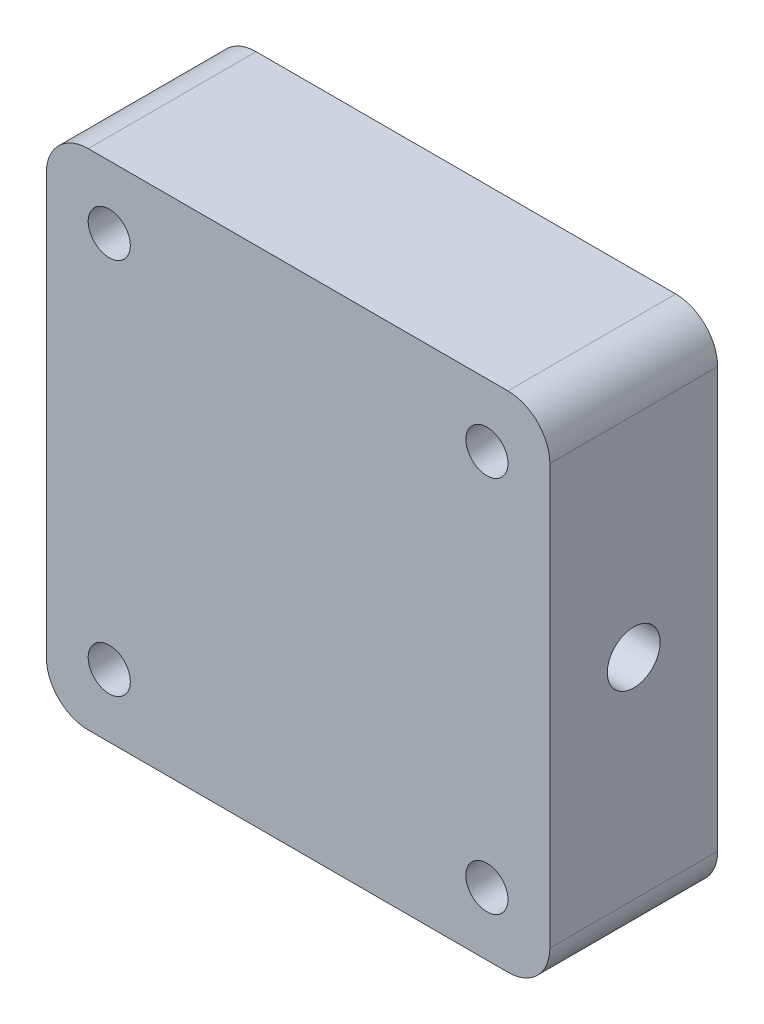
ISO-10303-21;
HEADER;
FILE_DESCRIPTION(('STEP AP214'),'2;1');
FILE_NAME('part.step','',(''),(''),'','','');
FILE_SCHEMA(('AUTOMOTIVE_DESIGN { 1 0 10303 214 1 1 1 1 }'));
ENDSEC;
DATA;
#1=APPLICATION_CONTEXT('core data for automotive mechanical design processes');
#2=APPLICATION_PROTOCOL_DEFINITION('international standard','automotive_design',2000,#1);
#3=PRODUCT_CONTEXT('',#1,'mechanical');
#4=PRODUCT('Part','Part','',(#3));
#5=PRODUCT_RELATED_PRODUCT_CATEGORY('part','',(#4));
#6=PRODUCT_DEFINITION_FORMATION('','',#4);
#7=PRODUCT_DEFINITION_CONTEXT('part definition',#1,'design');
#8=PRODUCT_DEFINITION('design','',#6,#7);
#9=PRODUCT_DEFINITION_SHAPE('','',#8);
#10=(LENGTH_UNIT() NAMED_UNIT(*) SI_UNIT(.MILLI.,.METRE.));
#11=(NAMED_UNIT(*) PLANE_ANGLE_UNIT() SI_UNIT($,.RADIAN.));
#12=(NAMED_UNIT(*) SI_UNIT($,.STERADIAN.) SOLID_ANGLE_UNIT());
#13=UNCERTAINTY_MEASURE_WITH_UNIT(LENGTH_MEASURE(1.E-05),#10,'distance_accuracy_value','');
#14=(GEOMETRIC_REPRESENTATION_CONTEXT(3) GLOBAL_UNCERTAINTY_ASSIGNED_CONTEXT((#13)) GLOBAL_UNIT_ASSIGNED_CONTEXT((#10,
#11,#12)) REPRESENTATION_CONTEXT('',''));
#15=CARTESIAN_POINT('',(0.,0.,0.));
#16=DIRECTION('',(0.,0.,1.));
#17=DIRECTION('',(1.,0.,0.));
#18=AXIS2_PLACEMENT_3D('',#15,#16,#17);
#19=CARTESIAN_POINT('',(-20.955,-20.955,21.082));
#20=DIRECTION('',(0.,0.,1.));
#21=DIRECTION('',(1.,0.,0.));
#22=AXIS2_PLACEMENT_3D('',#19,#20,#21);
#23=PLANE('',#22);
#24=CARTESIAN_POINT('',(18.8595,-18.8595,21.082));
#25=DIRECTION('',(0.,0.,1.));
#26=DIRECTION('',(1.,0.,0.));
#27=AXIS2_PLACEMENT_3D('',#24,#25,#26);
#28=CIRCLE('',#27,2.103882);
#29=CARTESIAN_POINT('',(20.963382,-18.8595,21.082));
#30=VERTEX_POINT('',#29);
#31=EDGE_CURVE('E220',#30,#30,#28,.T.);
#32=ORIENTED_EDGE('',*,*,#31,.F.);
#33=EDGE_LOOP('',(#32));
#34=FACE_BOUND('',#33,.T.);
#35=CARTESIAN_POINT('',(-18.8595,18.8595,21.082));
#36=DIRECTION('',(0.,0.,1.));
#37=DIRECTION('',(1.,0.,0.));
#38=AXIS2_PLACEMENT_3D('',#35,#36,#37);
#39=CIRCLE('',#38,2.103882);
#40=CARTESIAN_POINT('',(-16.755618,18.8595,21.082));
#41=VERTEX_POINT('',#40);
#42=EDGE_CURVE('E145',#41,#41,#39,.T.);
#43=ORIENTED_EDGE('',*,*,#42,.F.);
#44=EDGE_LOOP('',(#43));
#45=FACE_BOUND('',#44,.T.);
#46=CARTESIAN_POINT('',(-20.955,-20.955,21.082));
#47=DIRECTION('',(0.,0.,1.));
#48=DIRECTION('',(1.,0.,0.));
#49=AXIS2_PLACEMENT_3D('',#46,#47,#48);
#50=CIRCLE('',#49,4.191);
#51=CARTESIAN_POINT('',(-25.146,-20.955,21.082));
#52=VERTEX_POINT('',#51);
#53=CARTESIAN_POINT('',(-20.955,-25.146,21.082));
#54=VERTEX_POINT('',#53);
#55=EDGE_CURVE('E163',#52,#54,#50,.T.);
#56=ORIENTED_EDGE('',*,*,#55,.T.);
#57=DIRECTION('',(1.,0.,0.));
#58=VECTOR('',#57,1.);
#59=CARTESIAN_POINT('',(-20.955,-25.146,21.082));
#60=LINE('',#59,#58);
#61=CARTESIAN_POINT('',(20.955,-25.146,21.082));
#62=VERTEX_POINT('',#61);
#63=EDGE_CURVE('E99',#54,#62,#60,.T.);
#64=ORIENTED_EDGE('',*,*,#63,.T.);
#65=CARTESIAN_POINT('',(20.955,-20.955,21.082));
#66=DIRECTION('',(0.,0.,1.));
#67=DIRECTION('',(1.,0.,0.));
#68=AXIS2_PLACEMENT_3D('',#65,#66,#67);
#69=CIRCLE('',#68,4.191);
#70=CARTESIAN_POINT('',(25.146,-20.955,21.082));
#71=VERTEX_POINT('',#70);
#72=EDGE_CURVE('E184',#62,#71,#69,.T.);
#73=ORIENTED_EDGE('',*,*,#72,.T.);
#74=DIRECTION('',(0.,1.,0.));
#75=VECTOR('',#74,1.);
#76=CARTESIAN_POINT('',(25.146,20.955,21.082));
#77=LINE('',#76,#75);
#78=CARTESIAN_POINT('',(25.146,20.955,21.082));
#79=VERTEX_POINT('',#78);
#80=EDGE_CURVE('E198',#71,#79,#77,.T.);
#81=ORIENTED_EDGE('',*,*,#80,.T.);
#82=CARTESIAN_POINT('',(20.955,20.955,21.082));
#83=DIRECTION('',(0.,0.,1.));
#84=DIRECTION('',(-1.,0.,0.));
#85=AXIS2_PLACEMENT_3D('',#82,#83,#84);
#86=CIRCLE('',#85,4.191);
#87=CARTESIAN_POINT('',(20.955,25.146,21.082));
#88=VERTEX_POINT('',#87);
#89=EDGE_CURVE('E118',#79,#88,#86,.T.);
#90=ORIENTED_EDGE('',*,*,#89,.T.);
#91=DIRECTION('',(-1.,0.,0.));
#92=VECTOR('',#91,1.);
#93=CARTESIAN_POINT('',(-20.955,25.146,21.082));
#94=LINE('',#93,#92);
#95=CARTESIAN_POINT('',(-20.955,25.146,21.082));
#96=VERTEX_POINT('',#95);
#97=EDGE_CURVE('E112',#88,#96,#94,.T.);
#98=ORIENTED_EDGE('',*,*,#97,.T.);
#99=CARTESIAN_POINT('',(-20.955,20.955,21.082));
#100=DIRECTION('',(0.,0.,1.));
#101=DIRECTION('',(1.,0.,0.));
#102=AXIS2_PLACEMENT_3D('',#99,#100,#101);
#103=CIRCLE('',#102,4.191);
#104=CARTESIAN_POINT('',(-25.146,20.955,21.082));
#105=VERTEX_POINT('',#104);
#106=EDGE_CURVE('E116',#96,#105,#103,.T.);
#107=ORIENTED_EDGE('',*,*,#106,.T.);
#108=DIRECTION('',(0.,-1.,0.));
#109=VECTOR('',#108,1.);
#110=CARTESIAN_POINT('',(-25.146,20.955,21.082));
#111=LINE('',#110,#109);
#112=EDGE_CURVE('E56',#105,#52,#111,.T.);
#113=ORIENTED_EDGE('',*,*,#112,.T.);
#114=EDGE_LOOP('',(#56,#64,#73,#81,#90,#98,#107,#113));
#115=FACE_BOUND('',#114,.T.);
#116=CARTESIAN_POINT('',(18.8595,18.8595,21.082));
#117=DIRECTION('',(0.,0.,1.));
#118=DIRECTION('',(1.,0.,0.));
#119=AXIS2_PLACEMENT_3D('',#116,#117,#118);
#120=CIRCLE('',#119,2.103882);
#121=CARTESIAN_POINT('',(20.963382,18.8595,21.082));
#122=VERTEX_POINT('',#121);
#123=EDGE_CURVE('E212',#122,#122,#120,.T.);
#124=ORIENTED_EDGE('',*,*,#123,.F.);
#125=EDGE_LOOP('',(#124));
#126=FACE_BOUND('',#125,.T.);
#127=CARTESIAN_POINT('',(-18.8595,-18.8595,21.082));
#128=DIRECTION('',(0.,0.,1.));
#129=DIRECTION('',(1.,0.,0.));
#130=AXIS2_PLACEMENT_3D('',#127,#128,#129);
#131=CIRCLE('',#130,2.103882);
#132=CARTESIAN_POINT('',(-16.755618,-18.8595,21.082));
#133=VERTEX_POINT('',#132);
#134=EDGE_CURVE('E228',#133,#133,#131,.T.);
#135=ORIENTED_EDGE('',*,*,#134,.F.);
#136=EDGE_LOOP('',(#135));
#137=FACE_BOUND('',#136,.T.);
#138=ADVANCED_FACE('F38',(#34,#45,#115,#126,#137),#23,.T.);
#139=CARTESIAN_POINT('',(-20.955,-20.955,4.318));
#140=DIRECTION('',(0.,0.,1.));
#141=DIRECTION('',(1.,0.,0.));
#142=AXIS2_PLACEMENT_3D('',#139,#140,#141);
#143=PLANE('',#142);
#144=CARTESIAN_POINT('',(-20.955,-20.955,4.318));
#145=DIRECTION('',(0.,0.,1.));
#146=DIRECTION('',(1.,0.,0.));
#147=AXIS2_PLACEMENT_3D('',#144,#145,#146);
#148=CIRCLE('',#147,4.191);
#149=CARTESIAN_POINT('',(-25.146,-20.955,4.318));
#150=VERTEX_POINT('',#149);
#151=CARTESIAN_POINT('',(-20.955,-25.146,4.318));
#152=VERTEX_POINT('',#151);
#153=EDGE_CURVE('E140',#150,#152,#148,.T.);
#154=ORIENTED_EDGE('',*,*,#153,.F.);
#155=DIRECTION('',(0.,-1.,0.));
#156=VECTOR('',#155,1.);
#157=CARTESIAN_POINT('',(-25.146,20.955,4.318));
#158=LINE('',#157,#156);
#159=CARTESIAN_POINT('',(-25.146,20.955,4.318));
#160=VERTEX_POINT('',#159);
#161=EDGE_CURVE('E91',#160,#150,#158,.T.);
#162=ORIENTED_EDGE('',*,*,#161,.F.);
#163=CARTESIAN_POINT('',(-20.955,20.955,4.318));
#164=DIRECTION('',(0.,0.,1.));
#165=DIRECTION('',(1.,0.,0.));
#166=AXIS2_PLACEMENT_3D('',#163,#164,#165);
#167=CIRCLE('',#166,4.191);
#168=CARTESIAN_POINT('',(-20.955,25.146,4.318));
#169=VERTEX_POINT('',#168);
#170=EDGE_CURVE('E85',#169,#160,#167,.T.);
#171=ORIENTED_EDGE('',*,*,#170,.F.);
#172=DIRECTION('',(-1.,0.,0.));
#173=VECTOR('',#172,1.);
#174=CARTESIAN_POINT('',(-20.955,25.146,4.318));
#175=LINE('',#174,#173);
#176=CARTESIAN_POINT('',(20.955,25.146,4.318));
#177=VERTEX_POINT('',#176);
#178=EDGE_CURVE('E127',#177,#169,#175,.T.);
#179=ORIENTED_EDGE('',*,*,#178,.F.);
#180=CARTESIAN_POINT('',(20.955,20.955,4.318));
#181=DIRECTION('',(0.,0.,1.));
#182=DIRECTION('',(-1.,0.,0.));
#183=AXIS2_PLACEMENT_3D('',#180,#181,#182);
#184=CIRCLE('',#183,4.191);
#185=CARTESIAN_POINT('',(25.146,20.955,4.318));
#186=VERTEX_POINT('',#185);
#187=EDGE_CURVE('E154',#186,#177,#184,.T.);
#188=ORIENTED_EDGE('',*,*,#187,.F.);
#189=DIRECTION('',(0.,1.,0.));
#190=VECTOR('',#189,1.);
#191=CARTESIAN_POINT('',(25.146,20.955,4.318));
#192=LINE('',#191,#190);
#193=CARTESIAN_POINT('',(25.146,-20.955,4.318));
#194=VERTEX_POINT('',#193);
#195=EDGE_CURVE('E151',#194,#186,#192,.T.);
#196=ORIENTED_EDGE('',*,*,#195,.F.);
#197=CARTESIAN_POINT('',(20.955,-20.955,4.318));
#198=DIRECTION('',(0.,0.,1.));
#199=DIRECTION('',(1.,0.,0.));
#200=AXIS2_PLACEMENT_3D('',#197,#198,#199);
#201=CIRCLE('',#200,4.191);
#202=CARTESIAN_POINT('',(20.955,-25.146,4.318));
#203=VERTEX_POINT('',#202);
#204=EDGE_CURVE('E148',#203,#194,#201,.T.);
#205=ORIENTED_EDGE('',*,*,#204,.F.);
#206=DIRECTION('',(1.,0.,0.));
#207=VECTOR('',#206,1.);
#208=CARTESIAN_POINT('',(-20.955,-25.146,4.318));
#209=LINE('',#208,#207);
#210=EDGE_CURVE('E144',#152,#203,#209,.T.);
#211=ORIENTED_EDGE('',*,*,#210,.F.);
#212=EDGE_LOOP('',(#154,#162,#171,#179,#188,#196,#205,#211));
#213=FACE_BOUND('',#212,.T.);
#214=CARTESIAN_POINT('',(-18.8595,18.8595,4.318));
#215=DIRECTION('',(0.,0.,1.));
#216=DIRECTION('',(1.,0.,0.));
#217=AXIS2_PLACEMENT_3D('',#214,#215,#216);
#218=CIRCLE('',#217,2.103882);
#219=CARTESIAN_POINT('',(-16.755618,18.8595,4.318));
#220=VERTEX_POINT('',#219);
#221=EDGE_CURVE('E208',#220,#220,#218,.T.);
#222=ORIENTED_EDGE('',*,*,#221,.T.);
#223=EDGE_LOOP('',(#222));
#224=FACE_BOUND('',#223,.T.);
#225=CARTESIAN_POINT('',(18.8595,18.8595,4.318));
#226=DIRECTION('',(0.,0.,1.));
#227=DIRECTION('',(1.,0.,0.));
#228=AXIS2_PLACEMENT_3D('',#225,#226,#227);
#229=CIRCLE('',#228,2.103882);
#230=CARTESIAN_POINT('',(20.963382,18.8595,4.318));
#231=VERTEX_POINT('',#230);
#232=EDGE_CURVE('E216',#231,#231,#229,.T.);
#233=ORIENTED_EDGE('',*,*,#232,.T.);
#234=EDGE_LOOP('',(#233));
#235=FACE_BOUND('',#234,.T.);
#236=CARTESIAN_POINT('',(18.8595,-18.8595,4.318));
#237=DIRECTION('',(0.,0.,1.));
#238=DIRECTION('',(1.,0.,0.));
#239=AXIS2_PLACEMENT_3D('',#236,#237,#238);
#240=CIRCLE('',#239,2.103882);
#241=CARTESIAN_POINT('',(20.963382,-18.8595,4.318));
#242=VERTEX_POINT('',#241);
#243=EDGE_CURVE('E224',#242,#242,#240,.T.);
#244=ORIENTED_EDGE('',*,*,#243,.T.);
#245=EDGE_LOOP('',(#244));
#246=FACE_BOUND('',#245,.T.);
#247=CARTESIAN_POINT('',(-18.8595,-18.8595,4.318));
#248=DIRECTION('',(0.,0.,1.));
#249=DIRECTION('',(1.,0.,0.));
#250=AXIS2_PLACEMENT_3D('',#247,#248,#249);
#251=CIRCLE('',#250,2.103882);
#252=CARTESIAN_POINT('',(-16.755618,-18.8595,4.318));
#253=VERTEX_POINT('',#252);
#254=EDGE_CURVE('E232',#253,#253,#251,.T.);
#255=ORIENTED_EDGE('',*,*,#254,.T.);
#256=EDGE_LOOP('',(#255));
#257=FACE_BOUND('',#256,.T.);
#258=ADVANCED_FACE('F188',(#213,#224,#235,#246,#257),#143,.F.);
#259=CARTESIAN_POINT('',(-20.955,-20.955,21.082));
#260=DIRECTION('',(0.,0.,-1.));
#261=DIRECTION('',(-1.,0.,0.));
#262=AXIS2_PLACEMENT_3D('',#259,#260,#261);
#263=CYLINDRICAL_SURFACE('',#262,4.191);
#264=ORIENTED_EDGE('',*,*,#153,.T.);
#265=DIRECTION('',(0.,0.,-1.));
#266=VECTOR('',#265,1.);
#267=CARTESIAN_POINT('',(-20.955,-25.146,21.082));
#268=LINE('',#267,#266);
#269=EDGE_CURVE('E11',#54,#152,#268,.T.);
#270=ORIENTED_EDGE('',*,*,#269,.F.);
#271=ORIENTED_EDGE('',*,*,#55,.F.);
#272=DIRECTION('',(0.,0.,-1.));
#273=VECTOR('',#272,1.);
#274=CARTESIAN_POINT('',(-25.146,-20.955,21.082));
#275=LINE('',#274,#273);
#276=EDGE_CURVE('E136',#52,#150,#275,.T.);
#277=ORIENTED_EDGE('',*,*,#276,.T.);
#278=EDGE_LOOP('',(#264,#270,#271,#277));
#279=FACE_BOUND('',#278,.T.);
#280=ADVANCED_FACE('F40',(#279),#263,.T.);
#281=CARTESIAN_POINT('',(-20.955,-25.146,21.082));
#282=DIRECTION('',(0.,1.,0.));
#283=DIRECTION('',(0.,0.,1.));
#284=AXIS2_PLACEMENT_3D('',#281,#282,#283);
#285=PLANE('',#284);
#286=ORIENTED_EDGE('',*,*,#210,.T.);
#287=DIRECTION('',(0.,0.,-1.));
#288=VECTOR('',#287,1.);
#289=CARTESIAN_POINT('',(20.955,-25.146,21.082));
#290=LINE('',#289,#288);
#291=EDGE_CURVE('E48',#62,#203,#290,.T.);
#292=ORIENTED_EDGE('',*,*,#291,.F.);
#293=ORIENTED_EDGE('',*,*,#63,.F.);
#294=ORIENTED_EDGE('',*,*,#269,.T.);
#295=EDGE_LOOP('',(#286,#292,#293,#294));
#296=FACE_BOUND('',#295,.T.);
#297=ADVANCED_FACE('F264',(#296),#285,.F.);
#298=CARTESIAN_POINT('',(20.955,-20.955,21.082));
#299=DIRECTION('',(0.,0.,-1.));
#300=DIRECTION('',(-1.,0.,0.));
#301=AXIS2_PLACEMENT_3D('',#298,#299,#300);
#302=CYLINDRICAL_SURFACE('',#301,4.191);
#303=ORIENTED_EDGE('',*,*,#204,.T.);
#304=DIRECTION('',(0.,0.,-1.));
#305=VECTOR('',#304,1.);
#306=CARTESIAN_POINT('',(25.146,-20.955,21.082));
#307=LINE('',#306,#305);
#308=EDGE_CURVE('E174',#71,#194,#307,.T.);
#309=ORIENTED_EDGE('',*,*,#308,.F.);
#310=ORIENTED_EDGE('',*,*,#72,.F.);
#311=ORIENTED_EDGE('',*,*,#291,.T.);
#312=EDGE_LOOP('',(#303,#309,#310,#311));
#313=FACE_BOUND('',#312,.T.);
#314=ADVANCED_FACE('F182',(#313),#302,.T.);
#315=CARTESIAN_POINT('',(25.146,20.955,21.082));
#316=DIRECTION('',(-1.,0.,0.));
#317=DIRECTION('',(0.,0.,1.));
#318=AXIS2_PLACEMENT_3D('',#315,#316,#317);
#319=PLANE('',#318);
#320=CARTESIAN_POINT('',(25.146,0.,12.7));
#321=DIRECTION('',(1.,0.,0.));
#322=DIRECTION('',(0.,0.,-1.));
#323=AXIS2_PLACEMENT_3D('',#320,#321,#322);
#324=CIRCLE('',#323,2.64);
#325=CARTESIAN_POINT('',(25.146,0.,10.06));
#326=VERTEX_POINT('',#325);
#327=EDGE_CURVE('E240',#326,#326,#324,.T.);
#328=ORIENTED_EDGE('',*,*,#327,.F.);
#329=EDGE_LOOP('',(#328));
#330=FACE_BOUND('',#329,.T.);
#331=ORIENTED_EDGE('',*,*,#195,.T.);
#332=DIRECTION('',(0.,0.,-1.));
#333=VECTOR('',#332,1.);
#334=CARTESIAN_POINT('',(25.146,20.955,21.082));
#335=LINE('',#334,#333);
#336=EDGE_CURVE('E170',#79,#186,#335,.T.);
#337=ORIENTED_EDGE('',*,*,#336,.F.);
#338=ORIENTED_EDGE('',*,*,#80,.F.);
#339=ORIENTED_EDGE('',*,*,#308,.T.);
#340=EDGE_LOOP('',(#331,#337,#338,#339));
#341=FACE_BOUND('',#340,.T.);
#342=ADVANCED_FACE('F193',(#330,#341),#319,.F.);
#343=CARTESIAN_POINT('',(20.955,20.955,21.082));
#344=DIRECTION('',(0.,0.,-1.));
#345=DIRECTION('',(-1.,0.,0.));
#346=AXIS2_PLACEMENT_3D('',#343,#344,#345);
#347=CYLINDRICAL_SURFACE('',#346,4.191);
#348=ORIENTED_EDGE('',*,*,#187,.T.);
#349=DIRECTION('',(0.,0.,-1.));
#350=VECTOR('',#349,1.);
#351=CARTESIAN_POINT('',(20.955,25.146,21.082));
#352=LINE('',#351,#350);
#353=EDGE_CURVE('E129',#88,#177,#352,.T.);
#354=ORIENTED_EDGE('',*,*,#353,.F.);
#355=ORIENTED_EDGE('',*,*,#89,.F.);
#356=ORIENTED_EDGE('',*,*,#336,.T.);
#357=EDGE_LOOP('',(#348,#354,#355,#356));
#358=FACE_BOUND('',#357,.T.);
#359=ADVANCED_FACE('F196',(#358),#347,.T.);
#360=CARTESIAN_POINT('',(-20.955,25.146,21.082));
#361=DIRECTION('',(0.,-1.,0.));
#362=DIRECTION('',(0.,0.,-1.));
#363=AXIS2_PLACEMENT_3D('',#360,#361,#362);
#364=PLANE('',#363);
#365=ORIENTED_EDGE('',*,*,#178,.T.);
#366=DIRECTION('',(0.,0.,-1.));
#367=VECTOR('',#366,1.);
#368=CARTESIAN_POINT('',(-20.955,25.146,21.082));
#369=LINE('',#368,#367);
#370=EDGE_CURVE('E124',#96,#169,#369,.T.);
#371=ORIENTED_EDGE('',*,*,#370,.F.);
#372=ORIENTED_EDGE('',*,*,#97,.F.);
#373=ORIENTED_EDGE('',*,*,#353,.T.);
#374=EDGE_LOOP('',(#365,#371,#372,#373));
#375=FACE_BOUND('',#374,.T.);
#376=ADVANCED_FACE('F125',(#375),#364,.F.);
#377=CARTESIAN_POINT('',(-20.955,20.955,21.082));
#378=DIRECTION('',(0.,0.,-1.));
#379=DIRECTION('',(-1.,0.,0.));
#380=AXIS2_PLACEMENT_3D('',#377,#378,#379);
#381=CYLINDRICAL_SURFACE('',#380,4.191);
#382=ORIENTED_EDGE('',*,*,#170,.T.);
#383=DIRECTION('',(0.,0.,-1.));
#384=VECTOR('',#383,1.);
#385=CARTESIAN_POINT('',(-25.146,20.955,21.082));
#386=LINE('',#385,#384);
#387=EDGE_CURVE('E130',#105,#160,#386,.T.);
#388=ORIENTED_EDGE('',*,*,#387,.F.);
#389=ORIENTED_EDGE('',*,*,#106,.F.);
#390=ORIENTED_EDGE('',*,*,#370,.T.);
#391=EDGE_LOOP('',(#382,#388,#389,#390));
#392=FACE_BOUND('',#391,.T.);
#393=ADVANCED_FACE('F132',(#392),#381,.T.);
#394=CARTESIAN_POINT('',(-25.146,20.955,21.082));
#395=DIRECTION('',(1.,0.,0.));
#396=DIRECTION('',(0.,0.,-1.));
#397=AXIS2_PLACEMENT_3D('',#394,#395,#396);
#398=PLANE('',#397);
#399=CARTESIAN_POINT('',(-25.146,0.,12.7));
#400=DIRECTION('',(1.,0.,0.));
#401=DIRECTION('',(0.,0.,-1.));
#402=AXIS2_PLACEMENT_3D('',#399,#400,#401);
#403=CIRCLE('',#402,2.64);
#404=CARTESIAN_POINT('',(-25.146,0.,10.06));
#405=VERTEX_POINT('',#404);
#406=EDGE_CURVE('E236',#405,#405,#403,.T.);
#407=ORIENTED_EDGE('',*,*,#406,.T.);
#408=EDGE_LOOP('',(#407));
#409=FACE_BOUND('',#408,.T.);
#410=ORIENTED_EDGE('',*,*,#161,.T.);
#411=ORIENTED_EDGE('',*,*,#276,.F.);
#412=ORIENTED_EDGE('',*,*,#112,.F.);
#413=ORIENTED_EDGE('',*,*,#387,.T.);
#414=EDGE_LOOP('',(#410,#411,#412,#413));
#415=FACE_BOUND('',#414,.T.);
#416=ADVANCED_FACE('F248',(#409,#415),#398,.F.);
#417=CARTESIAN_POINT('',(-18.8595,18.8595,21.082));
#418=DIRECTION('',(0.,0.,-1.));
#419=DIRECTION('',(-1.,0.,0.));
#420=AXIS2_PLACEMENT_3D('',#417,#418,#419);
#421=CYLINDRICAL_SURFACE('',#420,2.103882);
#422=ORIENTED_EDGE('',*,*,#42,.T.);
#423=EDGE_LOOP('',(#422));
#424=FACE_BOUND('',#423,.T.);
#425=ORIENTED_EDGE('',*,*,#221,.F.);
#426=EDGE_LOOP('',(#425));
#427=FACE_BOUND('',#426,.T.);
#428=ADVANCED_FACE('F276',(#424,#427),#421,.F.);
#429=CARTESIAN_POINT('',(18.8595,18.8595,21.082));
#430=DIRECTION('',(0.,0.,-1.));
#431=DIRECTION('',(-1.,0.,0.));
#432=AXIS2_PLACEMENT_3D('',#429,#430,#431);
#433=CYLINDRICAL_SURFACE('',#432,2.103882);
#434=ORIENTED_EDGE('',*,*,#123,.T.);
#435=EDGE_LOOP('',(#434));
#436=FACE_BOUND('',#435,.T.);
#437=ORIENTED_EDGE('',*,*,#232,.F.);
#438=EDGE_LOOP('',(#437));
#439=FACE_BOUND('',#438,.T.);
#440=ADVANCED_FACE('F302',(#436,#439),#433,.F.);
#441=CARTESIAN_POINT('',(18.8595,-18.8595,21.082));
#442=DIRECTION('',(0.,0.,-1.));
#443=DIRECTION('',(-1.,0.,0.));
#444=AXIS2_PLACEMENT_3D('',#441,#442,#443);
#445=CYLINDRICAL_SURFACE('',#444,2.103882);
#446=ORIENTED_EDGE('',*,*,#31,.T.);
#447=EDGE_LOOP('',(#446));
#448=FACE_BOUND('',#447,.T.);
#449=ORIENTED_EDGE('',*,*,#243,.F.);
#450=EDGE_LOOP('',(#449));
#451=FACE_BOUND('',#450,.T.);
#452=ADVANCED_FACE('F309',(#448,#451),#445,.F.);
#453=CARTESIAN_POINT('',(-18.8595,-18.8595,21.082));
#454=DIRECTION('',(0.,0.,-1.));
#455=DIRECTION('',(-1.,0.,0.));
#456=AXIS2_PLACEMENT_3D('',#453,#454,#455);
#457=CYLINDRICAL_SURFACE('',#456,2.103882);
#458=ORIENTED_EDGE('',*,*,#134,.T.);
#459=EDGE_LOOP('',(#458));
#460=FACE_BOUND('',#459,.T.);
#461=ORIENTED_EDGE('',*,*,#254,.F.);
#462=EDGE_LOOP('',(#461));
#463=FACE_BOUND('',#462,.T.);
#464=ADVANCED_FACE('F253',(#460,#463),#457,.F.);
#465=CARTESIAN_POINT('',(-25.146,0.,12.7));
#466=DIRECTION('',(1.,0.,0.));
#467=DIRECTION('',(0.,0.,-1.));
#468=AXIS2_PLACEMENT_3D('',#465,#466,#467);
#469=CYLINDRICAL_SURFACE('',#468,2.64);
#470=CARTESIAN_POINT('',(-25.146,0.,10.06));
#471=CARTESIAN_POINT('',(-24.622125,0.,10.06));
#472=CARTESIAN_POINT('',(-24.09825,0.,10.06));
#473=CARTESIAN_POINT('',(-23.0505,0.,10.06));
#474=CARTESIAN_POINT('',(-22.526625,0.,10.06));
#475=CARTESIAN_POINT('',(-21.478875,0.,10.06));
#476=CARTESIAN_POINT('',(-20.955,0.,10.06));
#477=CARTESIAN_POINT('',(-19.90725,0.,10.06));
#478=CARTESIAN_POINT('',(-19.383375,0.,10.06));
#479=CARTESIAN_POINT('',(-18.335625,0.,10.06));
#480=CARTESIAN_POINT('',(-17.81175,0.,10.06));
#481=CARTESIAN_POINT('',(-16.764,0.,10.06));
#482=CARTESIAN_POINT('',(-16.240125,0.,10.06));
#483=CARTESIAN_POINT('',(-15.192375,0.,10.06));
#484=CARTESIAN_POINT('',(-14.6685,0.,10.06));
#485=CARTESIAN_POINT('',(-13.62075,0.,10.06));
#486=CARTESIAN_POINT('',(-13.096875,0.,10.06));
#487=CARTESIAN_POINT('',(-12.049125,0.,10.06));
#488=CARTESIAN_POINT('',(-11.52525,0.,10.06));
#489=CARTESIAN_POINT('',(-10.4775,0.,10.06));
#490=CARTESIAN_POINT('',(-9.95362500000001,0.,10.06));
#491=CARTESIAN_POINT('',(-8.90587500000001,0.,10.06));
#492=CARTESIAN_POINT('',(-8.38200000000001,0.,10.06));
#493=CARTESIAN_POINT('',(-7.33425000000001,0.,10.06));
#494=CARTESIAN_POINT('',(-6.81037500000001,0.,10.06));
#495=CARTESIAN_POINT('',(-5.76262500000001,0.,10.06));
#496=CARTESIAN_POINT('',(-5.23875000000001,0.,10.06));
#497=CARTESIAN_POINT('',(-4.19100000000001,0.,10.06));
#498=CARTESIAN_POINT('',(-3.66712500000001,0.,10.06));
#499=CARTESIAN_POINT('',(-2.61937500000001,0.,10.06));
#500=CARTESIAN_POINT('',(-2.09550000000001,0.,10.06));
#501=CARTESIAN_POINT('',(-1.04775000000001,0.,10.06));
#502=CARTESIAN_POINT('',(-0.523875000000011,0.,10.06));
#503=CARTESIAN_POINT('',(0.52387499999999,0.,10.06));
#504=CARTESIAN_POINT('',(1.04774999999999,0.,10.06));
#505=CARTESIAN_POINT('',(2.09549999999999,0.,10.06));
#506=CARTESIAN_POINT('',(2.61937499999999,0.,10.06));
#507=CARTESIAN_POINT('',(3.66712499999999,0.,10.06));
#508=CARTESIAN_POINT('',(4.19099999999999,0.,10.06));
#509=CARTESIAN_POINT('',(5.23874999999999,0.,10.06));
#510=CARTESIAN_POINT('',(5.76262499999999,0.,10.06));
#511=CARTESIAN_POINT('',(6.81037499999999,0.,10.06));
#512=CARTESIAN_POINT('',(7.33424999999999,0.,10.06));
#513=CARTESIAN_POINT('',(8.38199999999999,0.,10.06));
#514=CARTESIAN_POINT('',(8.90587499999999,0.,10.06));
#515=CARTESIAN_POINT('',(9.95362499999999,0.,10.06));
#516=CARTESIAN_POINT('',(10.4775,0.,10.06));
#517=CARTESIAN_POINT('',(11.52525,0.,10.06));
#518=CARTESIAN_POINT('',(12.049125,0.,10.06));
#519=CARTESIAN_POINT('',(13.096875,0.,10.06));
#520=CARTESIAN_POINT('',(13.62075,0.,10.06));
#521=CARTESIAN_POINT('',(14.6685,0.,10.06));
#522=CARTESIAN_POINT('',(15.192375,0.,10.06));
#523=CARTESIAN_POINT('',(16.240125,0.,10.06));
#524=CARTESIAN_POINT('',(16.764,0.,10.06));
#525=CARTESIAN_POINT('',(17.81175,0.,10.06));
#526=CARTESIAN_POINT('',(18.335625,0.,10.06));
#527=CARTESIAN_POINT('',(19.383375,0.,10.06));
#528=CARTESIAN_POINT('',(19.90725,0.,10.06));
#529=CARTESIAN_POINT('',(20.955,0.,10.06));
#530=CARTESIAN_POINT('',(21.478875,0.,10.06));
#531=CARTESIAN_POINT('',(22.526625,0.,10.06));
#532=CARTESIAN_POINT('',(23.0505,0.,10.06));
#533=CARTESIAN_POINT('',(24.09825,0.,10.06));
#534=CARTESIAN_POINT('',(24.622125,0.,10.06));
#535=CARTESIAN_POINT('',(25.146,0.,10.06));
#536=B_SPLINE_CURVE_WITH_KNOTS('',3,(#470,#471,#472,#473,#474,#475,#476,#477,#478,#479,#480,
#481,#482,#483,#484,#485,#486,#487,#488,#489,#490,#491,#492,#493,#494,#495,#496,#497,#498,#499,
#500,#501,#502,#503,#504,#505,#506,#507,#508,#509,#510,#511,#512,#513,#514,#515,#516,#517,#518,
#519,#520,#521,#522,#523,#524,#525,#526,#527,#528,#529,#530,#531,#532,#533,#534,#535),
.UNSPECIFIED.,.F.,.F.,(4,2,2,2,2,2,2,2,2,2,2,2,2,2,2,2,2,2,2,2,2,2,2,2,2,2,2,2,2,2,2,2,4),(0.,
1.571625,3.14325,4.714875,6.2865,7.858125,9.42975,11.001375,12.573,14.144625,15.71625,17.287875,
18.8595,20.431125,22.00275,23.574375,25.146,26.717625,28.28925,29.860875,31.4325,33.004125,
34.57575,36.147375,37.719,39.290625,40.86225,42.433875,44.0055,45.577125,47.14875,48.720375,
50.292),.UNSPECIFIED.);
#537=EDGE_CURVE('BSEAM250',#405,#326,#536,.T.);
#538=ORIENTED_EDGE('',*,*,#406,.F.);
#539=ORIENTED_EDGE('',*,*,#327,.T.);
#540=ORIENTED_EDGE('',*,*,#537,.T.);
#541=ORIENTED_EDGE('',*,*,#537,.F.);
#542=EDGE_LOOP('',(#538,#540,#539,#541));
#543=FACE_BOUND('',#542,.T.);
#544=ADVANCED_FACE('F250',(#543),#469,.F.);
#545=CLOSED_SHELL('',(#138,#258,#280,#297,#314,#342,#359,#376,#393,#416,#428,#440,#452,#464,#544));
#546=MANIFOLD_SOLID_BREP('B2',#545);
#547=ADVANCED_BREP_SHAPE_REPRESENTATION('',(#18,#546),#14);
#548=SHAPE_DEFINITION_REPRESENTATION(#9,#547);
ENDSEC;
END-ISO-10303-21;
